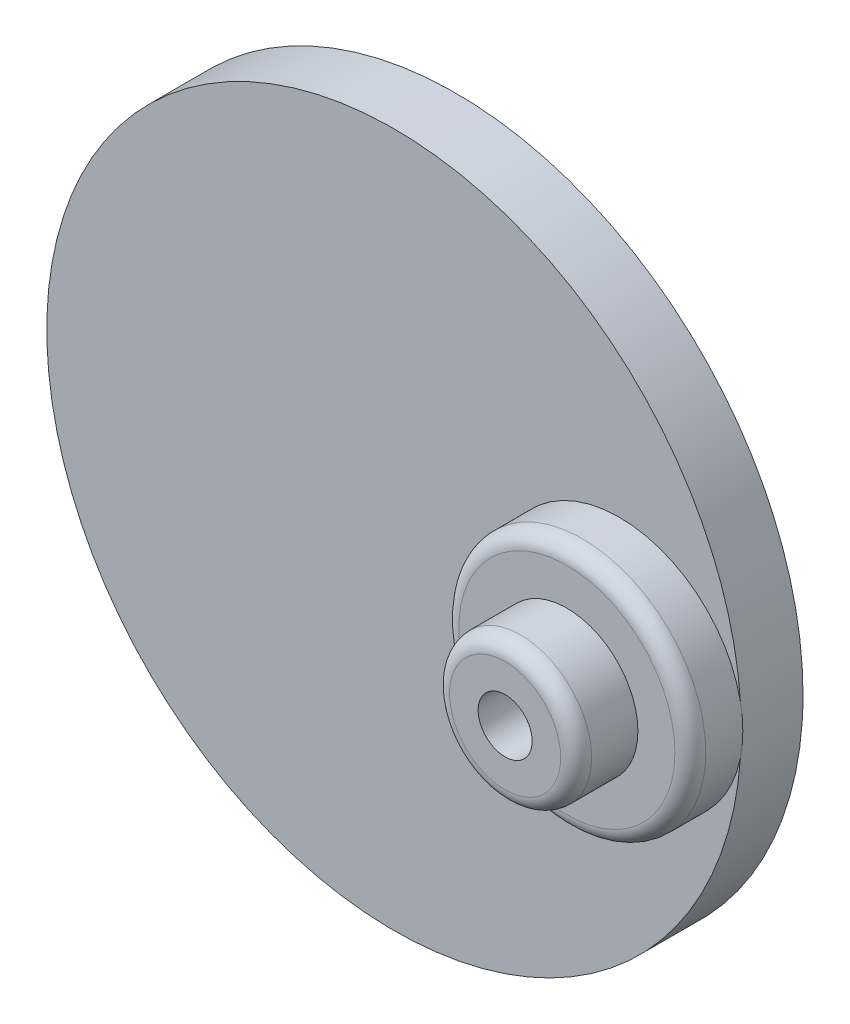
ISO-10303-21;
HEADER;
FILE_DESCRIPTION(('STEP AP214'),'2;1');
FILE_NAME('part.step','',(''),(''),'','','');
FILE_SCHEMA(('AUTOMOTIVE_DESIGN { 1 0 10303 214 1 1 1 1 }'));
ENDSEC;
DATA;
#1=APPLICATION_CONTEXT('core data for automotive mechanical design processes');
#2=APPLICATION_PROTOCOL_DEFINITION('international standard','automotive_design',2000,#1);
#3=PRODUCT_CONTEXT('',#1,'mechanical');
#4=PRODUCT('Part','Part','',(#3));
#5=PRODUCT_RELATED_PRODUCT_CATEGORY('part','',(#4));
#6=PRODUCT_DEFINITION_FORMATION('','',#4);
#7=PRODUCT_DEFINITION_CONTEXT('part definition',#1,'design');
#8=PRODUCT_DEFINITION('design','',#6,#7);
#9=PRODUCT_DEFINITION_SHAPE('','',#8);
#10=(LENGTH_UNIT() NAMED_UNIT(*) SI_UNIT(.MILLI.,.METRE.));
#11=(NAMED_UNIT(*) PLANE_ANGLE_UNIT() SI_UNIT($,.RADIAN.));
#12=(NAMED_UNIT(*) SI_UNIT($,.STERADIAN.) SOLID_ANGLE_UNIT());
#13=UNCERTAINTY_MEASURE_WITH_UNIT(LENGTH_MEASURE(1.E-05),#10,'distance_accuracy_value','');
#14=(GEOMETRIC_REPRESENTATION_CONTEXT(3) GLOBAL_UNCERTAINTY_ASSIGNED_CONTEXT((#13)) GLOBAL_UNIT_ASSIGNED_CONTEXT((#10,
#11,#12)) REPRESENTATION_CONTEXT('',''));
#15=CARTESIAN_POINT('',(0.,0.,0.));
#16=DIRECTION('',(0.,0.,1.));
#17=DIRECTION('',(1.,0.,0.));
#18=AXIS2_PLACEMENT_3D('',#15,#16,#17);
#19=CARTESIAN_POINT('',(0.,0.,2.));
#20=DIRECTION('',(0.,0.,-1.));
#21=DIRECTION('',(-1.00000000000001,0.,0.));
#22=AXIS2_PLACEMENT_3D('',#19,#20,#21);
#23=CYLINDRICAL_SURFACE('',#22,11.25);
#24=CARTESIAN_POINT('',(0.,0.,2.));
#25=DIRECTION('',(0.,0.,1.));
#26=DIRECTION('',(1.00000000000001,0.,0.));
#27=AXIS2_PLACEMENT_3D('',#24,#25,#26);
#28=CIRCLE('',#27,11.25);
#29=CARTESIAN_POINT('',(11.2227739726028,0.782204806857221,2.));
#30=VERTEX_POINT('',#29);
#31=CARTESIAN_POINT('',(11.2227739726028,-0.782204806857231,2.));
#32=VERTEX_POINT('',#31);
#33=EDGE_CURVE('E58',#30,#32,#28,.T.);
#34=ORIENTED_EDGE('',*,*,#33,.F.);
#35=EDGE_CURVE('E105',#32,#30,#28,.T.);
#36=ORIENTED_EDGE('',*,*,#35,.F.);
#37=EDGE_LOOP('',(#34,#36));
#38=FACE_BOUND('',#37,.T.);
#39=CARTESIAN_POINT('',(0.,0.,0.));
#40=DIRECTION('',(0.,0.,1.));
#41=DIRECTION('',(1.00000000000001,0.,0.));
#42=AXIS2_PLACEMENT_3D('',#39,#40,#41);
#43=CIRCLE('',#42,11.25);
#44=CARTESIAN_POINT('',(11.2500000000001,0.,0.));
#45=VERTEX_POINT('',#44);
#46=EDGE_CURVE('E102',#45,#45,#43,.T.);
#47=ORIENTED_EDGE('',*,*,#46,.T.);
#48=EDGE_LOOP('',(#47));
#49=FACE_BOUND('',#48,.T.);
#50=ADVANCED_FACE('F40',(#38,#49),#23,.T.);
#51=CARTESIAN_POINT('',(0.,0.,2.));
#52=DIRECTION('',(0.,0.,1.));
#53=DIRECTION('',(1.00000000000001,0.,0.));
#54=AXIS2_PLACEMENT_3D('',#51,#52,#53);
#55=PLANE('',#54);
#56=CARTESIAN_POINT('',(7.30000000000006,0.,2.));
#57=DIRECTION('',(0.,0.,1.));
#58=DIRECTION('',(1.00000000000001,0.,0.));
#59=AXIS2_PLACEMENT_3D('',#56,#57,#58);
#60=CIRCLE('',#59,4.);
#61=EDGE_CURVE('E55',#30,#32,#60,.T.);
#62=ORIENTED_EDGE('',*,*,#61,.F.);
#63=ORIENTED_EDGE('',*,*,#33,.T.);
#64=EDGE_LOOP('',(#62,#63));
#65=FACE_BOUND('',#64,.T.);
#66=ADVANCED_FACE('F138',(#65),#55,.T.);
#67=CARTESIAN_POINT('',(0.,0.,0.));
#68=DIRECTION('',(0.,0.,1.));
#69=DIRECTION('',(1.00000000000001,0.,0.));
#70=AXIS2_PLACEMENT_3D('',#67,#68,#69);
#71=PLANE('',#70);
#72=CARTESIAN_POINT('',(0.,0.,0.));
#73=DIRECTION('',(0.,0.,-1.));
#74=DIRECTION('',(-1.00000000000001,0.,0.));
#75=AXIS2_PLACEMENT_3D('',#72,#73,#74);
#76=CIRCLE('',#75,3.);
#77=CARTESIAN_POINT('',(-3.00000000000002,0.,0.));
#78=VERTEX_POINT('',#77);
#79=EDGE_CURVE('E90',#78,#78,#76,.T.);
#80=ORIENTED_EDGE('',*,*,#79,.F.);
#81=EDGE_LOOP('',(#80));
#82=FACE_BOUND('',#81,.T.);
#83=ORIENTED_EDGE('',*,*,#46,.F.);
#84=EDGE_LOOP('',(#83));
#85=FACE_BOUND('',#84,.T.);
#86=ADVANCED_FACE('F144',(#82,#85),#71,.F.);
#87=CARTESIAN_POINT('',(7.30000000000006,0.,2.));
#88=DIRECTION('',(0.,0.,1.));
#89=DIRECTION('',(1.00000000000001,0.,0.));
#90=AXIS2_PLACEMENT_3D('',#87,#88,#89);
#91=PLANE('',#90);
#92=EDGE_CURVE('E88',#32,#30,#60,.T.);
#93=ORIENTED_EDGE('',*,*,#92,.F.);
#94=ORIENTED_EDGE('',*,*,#35,.T.);
#95=EDGE_LOOP('',(#93,#94));
#96=FACE_BOUND('',#95,.T.);
#97=ADVANCED_FACE('F183',(#96),#91,.F.);
#98=CARTESIAN_POINT('',(7.30000000000006,0.,3.7));
#99=DIRECTION('',(0.,0.,-1.));
#100=DIRECTION('',(-1.00000000000001,0.,0.));
#101=AXIS2_PLACEMENT_3D('',#98,#99,#100);
#102=CYLINDRICAL_SURFACE('',#101,4.);
#103=CARTESIAN_POINT('',(7.30000000000006,0.,3.2));
#104=DIRECTION('',(0.,0.,1.));
#105=DIRECTION('',(1.00000000000001,0.,0.));
#106=AXIS2_PLACEMENT_3D('',#103,#104,#105);
#107=CIRCLE('',#106,4.);
#108=CARTESIAN_POINT('',(11.3000000000001,0.,3.2));
#109=VERTEX_POINT('',#108);
#110=EDGE_CURVE('E112',#109,#109,#107,.F.);
#111=ORIENTED_EDGE('',*,*,#110,.T.);
#112=EDGE_LOOP('',(#111));
#113=FACE_BOUND('',#112,.T.);
#114=ORIENTED_EDGE('',*,*,#61,.T.);
#115=ORIENTED_EDGE('',*,*,#92,.T.);
#116=EDGE_LOOP('',(#114,#115));
#117=FACE_BOUND('',#116,.T.);
#118=ADVANCED_FACE('F181',(#113,#117),#102,.T.);
#119=CARTESIAN_POINT('',(7.30000000000006,0.,3.7));
#120=DIRECTION('',(0.,0.,1.));
#121=DIRECTION('',(1.00000000000001,0.,0.));
#122=AXIS2_PLACEMENT_3D('',#119,#120,#121);
#123=PLANE('',#122);
#124=CARTESIAN_POINT('',(7.30000000000006,0.,3.7));
#125=DIRECTION('',(0.,0.,1.));
#126=DIRECTION('',(1.00000000000001,0.,0.));
#127=AXIS2_PLACEMENT_3D('',#124,#125,#126);
#128=CIRCLE('',#127,3.5);
#129=CARTESIAN_POINT('',(10.8000000000001,0.,3.7));
#130=VERTEX_POINT('',#129);
#131=EDGE_CURVE('E99',#130,#130,#128,.T.);
#132=ORIENTED_EDGE('',*,*,#131,.T.);
#133=EDGE_LOOP('',(#132));
#134=FACE_BOUND('',#133,.T.);
#135=CARTESIAN_POINT('',(7.30000000000006,0.,3.7));
#136=DIRECTION('',(0.,0.,1.));
#137=DIRECTION('',(1.00000000000001,0.,0.));
#138=AXIS2_PLACEMENT_3D('',#135,#136,#137);
#139=CIRCLE('',#138,2.3);
#140=CARTESIAN_POINT('',(9.60000000000007,0.,3.7));
#141=VERTEX_POINT('',#140);
#142=EDGE_CURVE('E95',#141,#141,#139,.T.);
#143=ORIENTED_EDGE('',*,*,#142,.F.);
#144=EDGE_LOOP('',(#143));
#145=FACE_BOUND('',#144,.T.);
#146=ADVANCED_FACE('F173',(#134,#145),#123,.T.);
#147=CARTESIAN_POINT('',(7.30000000000006,0.,5.7));
#148=DIRECTION('',(0.,0.,-1.));
#149=DIRECTION('',(-1.00000000000001,0.,0.));
#150=AXIS2_PLACEMENT_3D('',#147,#148,#149);
#151=CYLINDRICAL_SURFACE('',#150,2.3);
#152=CARTESIAN_POINT('',(7.30000000000006,0.,5.2));
#153=DIRECTION('',(0.,0.,1.));
#154=DIRECTION('',(1.00000000000001,0.,0.));
#155=AXIS2_PLACEMENT_3D('',#152,#153,#154);
#156=CIRCLE('',#155,2.3);
#157=CARTESIAN_POINT('',(9.60000000000007,0.,5.2));
#158=VERTEX_POINT('',#157);
#159=EDGE_CURVE('E94',#158,#158,#156,.F.);
#160=ORIENTED_EDGE('',*,*,#159,.T.);
#161=EDGE_LOOP('',(#160));
#162=FACE_BOUND('',#161,.T.);
#163=ORIENTED_EDGE('',*,*,#142,.T.);
#164=EDGE_LOOP('',(#163));
#165=FACE_BOUND('',#164,.T.);
#166=ADVANCED_FACE('F167',(#162,#165),#151,.T.);
#167=CARTESIAN_POINT('',(7.30000000000006,0.,5.7));
#168=DIRECTION('',(0.,0.,1.));
#169=DIRECTION('',(1.00000000000001,0.,0.));
#170=AXIS2_PLACEMENT_3D('',#167,#168,#169);
#171=PLANE('',#170);
#172=CARTESIAN_POINT('',(7.30000000000006,0.,5.7));
#173=DIRECTION('',(0.,0.,1.));
#174=DIRECTION('',(1.00000000000001,0.,0.));
#175=AXIS2_PLACEMENT_3D('',#172,#173,#174);
#176=CIRCLE('',#175,0.875);
#177=CARTESIAN_POINT('',(8.17500000000006,0.,5.7));
#178=VERTEX_POINT('',#177);
#179=EDGE_CURVE('E75',#178,#178,#176,.T.);
#180=ORIENTED_EDGE('',*,*,#179,.F.);
#181=EDGE_LOOP('',(#180));
#182=FACE_BOUND('',#181,.T.);
#183=CARTESIAN_POINT('',(7.30000000000006,0.,5.7));
#184=DIRECTION('',(0.,0.,1.));
#185=DIRECTION('',(1.00000000000001,0.,0.));
#186=AXIS2_PLACEMENT_3D('',#183,#184,#185);
#187=CIRCLE('',#186,1.8);
#188=CARTESIAN_POINT('',(9.10000000000007,0.,5.7));
#189=VERTEX_POINT('',#188);
#190=EDGE_CURVE('E116',#189,#189,#187,.T.);
#191=ORIENTED_EDGE('',*,*,#190,.T.);
#192=EDGE_LOOP('',(#191));
#193=FACE_BOUND('',#192,.T.);
#194=ADVANCED_FACE('F152',(#182,#193),#171,.T.);
#195=CARTESIAN_POINT('',(7.30000000000006,0.,3.2));
#196=DIRECTION('',(0.,0.,1.));
#197=DIRECTION('',(1.00000000000001,0.,0.));
#198=AXIS2_PLACEMENT_3D('',#195,#196,#197);
#199=TOROIDAL_SURFACE('',#198,3.5,0.5);
#200=ORIENTED_EDGE('',*,*,#110,.F.);
#201=EDGE_LOOP('',(#200));
#202=FACE_BOUND('',#201,.T.);
#203=ORIENTED_EDGE('',*,*,#131,.F.);
#204=EDGE_LOOP('',(#203));
#205=FACE_BOUND('',#204,.T.);
#206=ADVANCED_FACE('F149',(#202,#205),#199,.T.);
#207=CARTESIAN_POINT('',(7.30000000000006,0.,5.2));
#208=DIRECTION('',(0.,0.,1.));
#209=DIRECTION('',(1.00000000000001,0.,0.));
#210=AXIS2_PLACEMENT_3D('',#207,#208,#209);
#211=TOROIDAL_SURFACE('',#210,1.8,0.5);
#212=ORIENTED_EDGE('',*,*,#159,.F.);
#213=EDGE_LOOP('',(#212));
#214=FACE_BOUND('',#213,.T.);
#215=ORIENTED_EDGE('',*,*,#190,.F.);
#216=EDGE_LOOP('',(#215));
#217=FACE_BOUND('',#216,.T.);
#218=ADVANCED_FACE('F151',(#214,#217),#211,.T.);
#219=CARTESIAN_POINT('',(0.,0.,-4.));
#220=DIRECTION('',(0.,0.,1.));
#221=DIRECTION('',(1.00000000000001,0.,0.));
#222=AXIS2_PLACEMENT_3D('',#219,#220,#221);
#223=CYLINDRICAL_SURFACE('',#222,3.);
#224=CARTESIAN_POINT('',(0.,0.,-3.8));
#225=DIRECTION('',(0.,0.,-1.));
#226=DIRECTION('',(-1.00000000000001,0.,0.));
#227=AXIS2_PLACEMENT_3D('',#224,#225,#226);
#228=CIRCLE('',#227,3.);
#229=CARTESIAN_POINT('',(-3.00000000000002,0.,-3.8));
#230=VERTEX_POINT('',#229);
#231=EDGE_CURVE('E11',#230,#230,#228,.F.);
#232=ORIENTED_EDGE('',*,*,#231,.T.);
#233=EDGE_LOOP('',(#232));
#234=FACE_BOUND('',#233,.T.);
#235=ORIENTED_EDGE('',*,*,#79,.T.);
#236=EDGE_LOOP('',(#235));
#237=FACE_BOUND('',#236,.T.);
#238=ADVANCED_FACE('F155',(#234,#237),#223,.T.);
#239=CARTESIAN_POINT('',(0.,0.,-4.));
#240=DIRECTION('',(0.,0.,-1.));
#241=DIRECTION('',(-1.00000000000001,0.,0.));
#242=AXIS2_PLACEMENT_3D('',#239,#240,#241);
#243=PLANE('',#242);
#244=CARTESIAN_POINT('',(0.,0.,-4.));
#245=DIRECTION('',(0.,0.,-1.));
#246=DIRECTION('',(-1.00000000000001,0.,0.));
#247=AXIS2_PLACEMENT_3D('',#244,#245,#246);
#248=CIRCLE('',#247,2.8);
#249=CARTESIAN_POINT('',(-2.80000000000002,0.,-4.));
#250=VERTEX_POINT('',#249);
#251=EDGE_CURVE('E49',#250,#250,#248,.T.);
#252=ORIENTED_EDGE('',*,*,#251,.T.);
#253=EDGE_LOOP('',(#252));
#254=FACE_BOUND('',#253,.T.);
#255=CARTESIAN_POINT('',(0.,0.,-4.));
#256=DIRECTION('',(0.,0.,-1.));
#257=DIRECTION('',(-1.00000000000001,0.,0.));
#258=AXIS2_PLACEMENT_3D('',#255,#256,#257);
#259=CIRCLE('',#258,1.45);
#260=CARTESIAN_POINT('',(-1.45000000000001,0.,-4.));
#261=VERTEX_POINT('',#260);
#262=EDGE_CURVE('E74',#261,#261,#259,.T.);
#263=ORIENTED_EDGE('',*,*,#262,.F.);
#264=EDGE_LOOP('',(#263));
#265=FACE_BOUND('',#264,.T.);
#266=ADVANCED_FACE('F127',(#254,#265),#243,.T.);
#267=CARTESIAN_POINT('',(0.,0.,-2.));
#268=DIRECTION('',(0.,0.,-1.));
#269=DIRECTION('',(-1.00000000000001,0.,0.));
#270=AXIS2_PLACEMENT_3D('',#267,#268,#269);
#271=CYLINDRICAL_SURFACE('',#270,1.45);
#272=CARTESIAN_POINT('',(0.,0.,-2.));
#273=DIRECTION('',(0.,0.,-1.));
#274=DIRECTION('',(-1.00000000000001,0.,0.));
#275=AXIS2_PLACEMENT_3D('',#272,#273,#274);
#276=CIRCLE('',#275,1.45);
#277=CARTESIAN_POINT('',(-1.45000000000001,0.,-2.));
#278=VERTEX_POINT('',#277);
#279=EDGE_CURVE('E81',#278,#278,#276,.T.);
#280=ORIENTED_EDGE('',*,*,#279,.F.);
#281=EDGE_LOOP('',(#280));
#282=FACE_BOUND('',#281,.T.);
#283=ORIENTED_EDGE('',*,*,#262,.T.);
#284=EDGE_LOOP('',(#283));
#285=FACE_BOUND('',#284,.T.);
#286=ADVANCED_FACE('F256',(#282,#285),#271,.F.);
#287=CARTESIAN_POINT('',(0.,0.,-2.));
#288=DIRECTION('',(0.,0.,-1.));
#289=DIRECTION('',(-1.00000000000001,0.,0.));
#290=AXIS2_PLACEMENT_3D('',#287,#288,#289);
#291=PLANE('',#290);
#292=ORIENTED_EDGE('',*,*,#279,.T.);
#293=EDGE_LOOP('',(#292));
#294=FACE_BOUND('',#293,.T.);
#295=ADVANCED_FACE('F67',(#294),#291,.T.);
#296=CARTESIAN_POINT('',(7.30000000000006,0.,0.699999999999999));
#297=DIRECTION('',(0.,0.,1.));
#298=DIRECTION('',(1.00000000000001,0.,0.));
#299=AXIS2_PLACEMENT_3D('',#296,#297,#298);
#300=CONICAL_SURFACE('',#299,0.874999999999998,1.02974425867665);
#301=CARTESIAN_POINT('',(7.30000000000005,0.,0.174246958350884));
#302=VERTEX_POINT('',#301);
#303=VERTEX_LOOP('',#302);
#304=FACE_BOUND('',#303,.T.);
#305=CARTESIAN_POINT('',(7.30000000000006,0.,0.699999999999999));
#306=DIRECTION('',(0.,0.,1.));
#307=DIRECTION('',(1.00000000000001,0.,0.));
#308=AXIS2_PLACEMENT_3D('',#305,#306,#307);
#309=CIRCLE('',#308,0.874999999999998);
#310=CARTESIAN_POINT('',(8.17500000000006,0.,0.699999999999999));
#311=VERTEX_POINT('',#310);
#312=EDGE_CURVE('E71',#311,#311,#309,.T.);
#313=ORIENTED_EDGE('',*,*,#312,.T.);
#314=EDGE_LOOP('',(#313));
#315=FACE_BOUND('',#314,.T.);
#316=ADVANCED_FACE('F63',(#304,#315),#300,.F.);
#317=CARTESIAN_POINT('',(7.30000000000006,0.,5.7));
#318=DIRECTION('',(0.,0.,1.));
#319=DIRECTION('',(1.00000000000001,0.,0.));
#320=AXIS2_PLACEMENT_3D('',#317,#318,#319);
#321=CYLINDRICAL_SURFACE('',#320,0.874999999999999);
#322=ORIENTED_EDGE('',*,*,#312,.F.);
#323=EDGE_LOOP('',(#322));
#324=FACE_BOUND('',#323,.T.);
#325=ORIENTED_EDGE('',*,*,#179,.T.);
#326=EDGE_LOOP('',(#325));
#327=FACE_BOUND('',#326,.T.);
#328=ADVANCED_FACE('F66',(#324,#327),#321,.F.);
#329=CARTESIAN_POINT('',(0.,0.,-3.8));
#330=DIRECTION('',(0.,0.,-1.));
#331=DIRECTION('',(-1.00000000000001,0.,0.));
#332=AXIS2_PLACEMENT_3D('',#329,#330,#331);
#333=TOROIDAL_SURFACE('',#332,2.8,0.2);
#334=ORIENTED_EDGE('',*,*,#231,.F.);
#335=EDGE_LOOP('',(#334));
#336=FACE_BOUND('',#335,.T.);
#337=ORIENTED_EDGE('',*,*,#251,.F.);
#338=EDGE_LOOP('',(#337));
#339=FACE_BOUND('',#338,.T.);
#340=ADVANCED_FACE('F42',(#336,#339),#333,.T.);
#341=CLOSED_SHELL('',(#50,#66,#86,#97,#118,#146,#166,#194,#206,#218,#238,#266,#286,#295,#316,
#328,#340));
#342=MANIFOLD_SOLID_BREP('B2',#341);
#343=ADVANCED_BREP_SHAPE_REPRESENTATION('',(#18,#342),#14);
#344=SHAPE_DEFINITION_REPRESENTATION(#9,#343);
ENDSEC;
END-ISO-10303-21;
